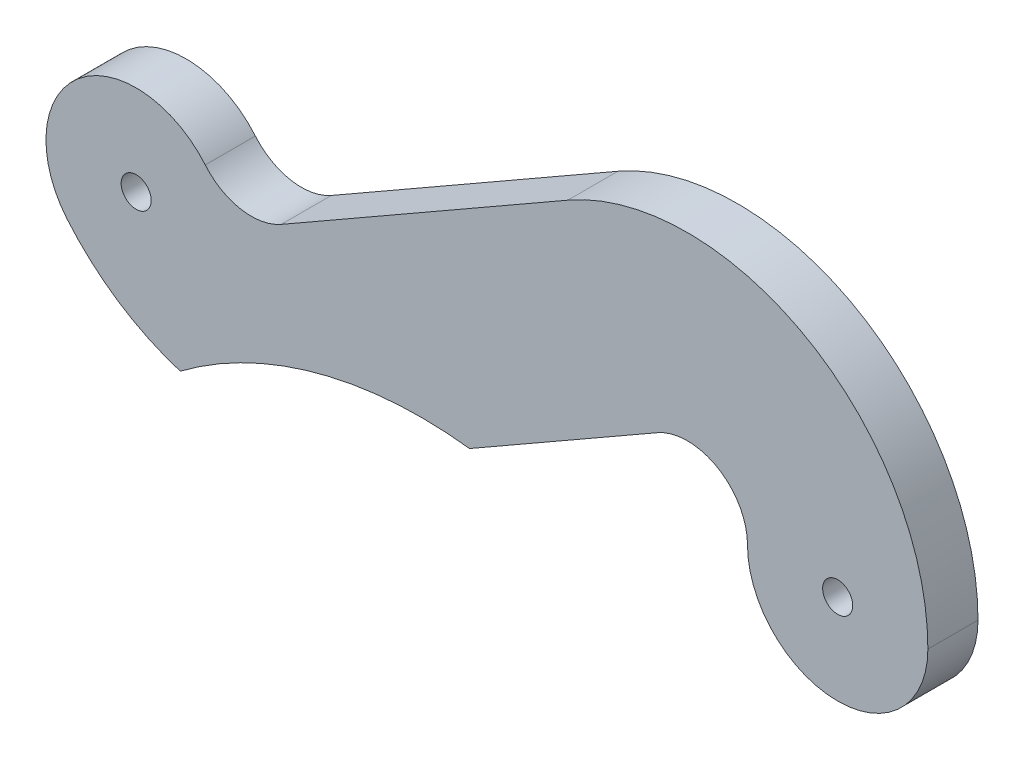
ISO-10303-21;
HEADER;
FILE_DESCRIPTION(('STEP AP214'),'2;1');
FILE_NAME('part.step','',(''),(''),'','','');
FILE_SCHEMA(('AUTOMOTIVE_DESIGN { 1 0 10303 214 1 1 1 1 }'));
ENDSEC;
DATA;
#1=APPLICATION_CONTEXT('core data for automotive mechanical design processes');
#2=APPLICATION_PROTOCOL_DEFINITION('international standard','automotive_design',2000,#1);
#3=PRODUCT_CONTEXT('',#1,'mechanical');
#4=PRODUCT('Part','Part','',(#3));
#5=PRODUCT_RELATED_PRODUCT_CATEGORY('part','',(#4));
#6=PRODUCT_DEFINITION_FORMATION('','',#4);
#7=PRODUCT_DEFINITION_CONTEXT('part definition',#1,'design');
#8=PRODUCT_DEFINITION('design','',#6,#7);
#9=PRODUCT_DEFINITION_SHAPE('','',#8);
#10=(LENGTH_UNIT() NAMED_UNIT(*) SI_UNIT(.MILLI.,.METRE.));
#11=(NAMED_UNIT(*) PLANE_ANGLE_UNIT() SI_UNIT($,.RADIAN.));
#12=(NAMED_UNIT(*) SI_UNIT($,.STERADIAN.) SOLID_ANGLE_UNIT());
#13=UNCERTAINTY_MEASURE_WITH_UNIT(LENGTH_MEASURE(1.E-05),#10,'distance_accuracy_value','');
#14=(GEOMETRIC_REPRESENTATION_CONTEXT(3) GLOBAL_UNCERTAINTY_ASSIGNED_CONTEXT((#13)) GLOBAL_UNIT_ASSIGNED_CONTEXT((#10,
#11,#12)) REPRESENTATION_CONTEXT('',''));
#15=CARTESIAN_POINT('',(0.,0.,0.));
#16=DIRECTION('',(0.,0.,1.));
#17=DIRECTION('',(1.,0.,0.));
#18=AXIS2_PLACEMENT_3D('',#15,#16,#17);
#19=CARTESIAN_POINT('',(11.4906666467847,9.64181414529811,5.));
#20=DIRECTION('',(0.,0.,1.));
#21=DIRECTION('',(1.,0.,0.));
#22=AXIS2_PLACEMENT_3D('',#19,#20,#21);
#23=PLANE('',#22);
#24=CARTESIAN_POINT('',(28.4512906579114,-45.2499284538988,5.));
#25=DIRECTION('',(0.,0.,1.));
#26=DIRECTION('',(-1.,0.,0.));
#27=AXIS2_PLACEMENT_3D('',#24,#25,#26);
#28=CIRCLE('',#27,40.);
#29=CARTESIAN_POINT('',(33.2657020757444,-5.5407173977743,5.));
#30=VERTEX_POINT('',#29);
#31=CARTESIAN_POINT('',(4.40154167070966,-13.2873006887636,5.));
#32=VERTEX_POINT('',#31);
#33=EDGE_CURVE('E181',#30,#32,#28,.T.);
#34=ORIENTED_EDGE('',*,*,#33,.F.);
#35=DIRECTION('',(0.867612200916755,0.497241459273445,0.));
#36=VECTOR('',#35,1.);
#37=CARTESIAN_POINT('',(23.4244616693473,-11.180878676704,5.));
#38=LINE('',#37,#36);
#39=CARTESIAN_POINT('',(52.0165512443593,5.20567320550047,5.));
#40=VERTEX_POINT('',#39);
#41=EDGE_CURVE('E186',#30,#40,#38,.T.);
#42=ORIENTED_EDGE('',*,*,#41,.T.);
#43=CARTESIAN_POINT('',(55.,0.,5.));
#44=DIRECTION('',(0.,0.,-1.));
#45=DIRECTION('',(1.,0.,0.));
#46=AXIS2_PLACEMENT_3D('',#43,#44,#45);
#47=CIRCLE('',#46,6.);
#48=CARTESIAN_POINT('',(61.,0.,5.));
#49=VERTEX_POINT('',#48);
#50=EDGE_CURVE('E115',#40,#49,#47,.T.);
#51=ORIENTED_EDGE('',*,*,#50,.T.);
#52=CARTESIAN_POINT('',(70.,0.,5.));
#53=DIRECTION('',(0.,0.,1.));
#54=DIRECTION('',(1.,0.,0.));
#55=AXIS2_PLACEMENT_3D('',#52,#53,#54);
#56=CIRCLE('',#55,9.);
#57=CARTESIAN_POINT('',(79.,0.,5.));
#58=VERTEX_POINT('',#57);
#59=EDGE_CURVE('E107',#49,#58,#56,.T.);
#60=ORIENTED_EDGE('',*,*,#59,.T.);
#61=CARTESIAN_POINT('',(55.,0.,5.));
#62=DIRECTION('',(0.,0.,1.));
#63=DIRECTION('',(1.,0.,0.));
#64=AXIS2_PLACEMENT_3D('',#61,#62,#63);
#65=CIRCLE('',#64,24.);
#66=CARTESIAN_POINT('',(43.0662049774373,20.8226928220021,5.));
#67=VERTEX_POINT('',#66);
#68=EDGE_CURVE('E112',#58,#67,#65,.T.);
#69=ORIENTED_EDGE('',*,*,#68,.T.);
#70=DIRECTION('',(-0.867612200916755,-0.497241459273445,0.));
#71=VECTOR('',#70,1.);
#72=CARTESIAN_POINT('',(14.4741154024253,4.43614093979759,5.));
#73=LINE('',#72,#71);
#74=CARTESIAN_POINT('',(14.4741154024253,4.43614093979759,5.));
#75=VERTEX_POINT('',#74);
#76=EDGE_CURVE('E56',#67,#75,#73,.T.);
#77=ORIENTED_EDGE('',*,*,#76,.T.);
#78=CARTESIAN_POINT('',(11.4906666467847,9.64181414529811,5.));
#79=DIRECTION('',(0.,0.,-1.));
#80=DIRECTION('',(1.,0.,0.));
#81=AXIS2_PLACEMENT_3D('',#78,#79,#80);
#82=CIRCLE('',#81,6.);
#83=CARTESIAN_POINT('',(6.89439998807079,5.78508848717887,5.));
#84=VERTEX_POINT('',#83);
#85=EDGE_CURVE('E153',#75,#84,#82,.T.);
#86=ORIENTED_EDGE('',*,*,#85,.T.);
#87=CARTESIAN_POINT('',(0.,0.,5.));
#88=DIRECTION('',(0.,0.,1.));
#89=DIRECTION('',(1.,0.,0.));
#90=AXIS2_PLACEMENT_3D('',#87,#88,#89);
#91=CIRCLE('',#90,9.);
#92=CARTESIAN_POINT('',(-6.89439998807079,-5.78508848717887,5.));
#93=VERTEX_POINT('',#92);
#94=EDGE_CURVE('E95',#84,#93,#91,.T.);
#95=ORIENTED_EDGE('',*,*,#94,.T.);
#96=CARTESIAN_POINT('',(11.4906666467847,9.64181414529811,5.));
#97=DIRECTION('',(0.,0.,1.));
#98=DIRECTION('',(1.,0.,0.));
#99=AXIS2_PLACEMENT_3D('',#96,#97,#98);
#100=CIRCLE('',#99,24.);
#101=EDGE_CURVE('E188',#93,#32,#100,.T.);
#102=ORIENTED_EDGE('',*,*,#101,.T.);
#103=EDGE_LOOP('',(#34,#42,#51,#60,#69,#77,#86,#95,#102));
#104=FACE_BOUND('',#103,.T.);
#105=CARTESIAN_POINT('',(70.,0.,5.));
#106=DIRECTION('',(0.,0.,1.));
#107=DIRECTION('',(1.,0.,0.));
#108=AXIS2_PLACEMENT_3D('',#105,#106,#107);
#109=CIRCLE('',#108,1.5);
#110=CARTESIAN_POINT('',(71.5,0.,5.));
#111=VERTEX_POINT('',#110);
#112=EDGE_CURVE('E140',#111,#111,#109,.T.);
#113=ORIENTED_EDGE('',*,*,#112,.F.);
#114=EDGE_LOOP('',(#113));
#115=FACE_BOUND('',#114,.T.);
#116=CARTESIAN_POINT('',(0.,0.,5.));
#117=DIRECTION('',(0.,0.,1.));
#118=DIRECTION('',(1.,0.,0.));
#119=AXIS2_PLACEMENT_3D('',#116,#117,#118);
#120=CIRCLE('',#119,1.5);
#121=CARTESIAN_POINT('',(1.5,0.,5.));
#122=VERTEX_POINT('',#121);
#123=EDGE_CURVE('E199',#122,#122,#120,.T.);
#124=ORIENTED_EDGE('',*,*,#123,.F.);
#125=EDGE_LOOP('',(#124));
#126=FACE_BOUND('',#125,.T.);
#127=ADVANCED_FACE('F33',(#104,#115,#126),#23,.T.);
#128=CARTESIAN_POINT('',(11.4906666467847,9.64181414529811,0.));
#129=DIRECTION('',(0.,0.,1.));
#130=DIRECTION('',(1.,0.,0.));
#131=AXIS2_PLACEMENT_3D('',#128,#129,#130);
#132=PLANE('',#131);
#133=CARTESIAN_POINT('',(70.,0.,0.));
#134=DIRECTION('',(0.,0.,1.));
#135=DIRECTION('',(1.,0.,0.));
#136=AXIS2_PLACEMENT_3D('',#133,#134,#135);
#137=CIRCLE('',#136,1.5);
#138=CARTESIAN_POINT('',(71.5,0.,0.));
#139=VERTEX_POINT('',#138);
#140=EDGE_CURVE('E196',#139,#139,#137,.T.);
#141=ORIENTED_EDGE('',*,*,#140,.T.);
#142=EDGE_LOOP('',(#141));
#143=FACE_BOUND('',#142,.T.);
#144=DIRECTION('',(0.867612200916755,0.497241459273445,0.));
#145=VECTOR('',#144,1.);
#146=CARTESIAN_POINT('',(23.4244616693473,-11.180878676704,0.));
#147=LINE('',#146,#145);
#148=CARTESIAN_POINT('',(33.2657020757444,-5.5407173977743,0.));
#149=VERTEX_POINT('',#148);
#150=CARTESIAN_POINT('',(52.0165512443593,5.20567320550047,0.));
#151=VERTEX_POINT('',#150);
#152=EDGE_CURVE('E145',#149,#151,#147,.T.);
#153=ORIENTED_EDGE('',*,*,#152,.F.);
#154=CARTESIAN_POINT('',(28.4512906579114,-45.2499284538988,0.));
#155=DIRECTION('',(0.,0.,1.));
#156=DIRECTION('',(1.,0.,0.));
#157=AXIS2_PLACEMENT_3D('',#154,#155,#156);
#158=CIRCLE('',#157,40.);
#159=CARTESIAN_POINT('',(4.40154167070966,-13.2873006887636,0.));
#160=VERTEX_POINT('',#159);
#161=EDGE_CURVE('E48',#149,#160,#158,.T.);
#162=ORIENTED_EDGE('',*,*,#161,.T.);
#163=CARTESIAN_POINT('',(11.4906666467847,9.64181414529811,0.));
#164=DIRECTION('',(0.,0.,1.));
#165=DIRECTION('',(1.,0.,0.));
#166=AXIS2_PLACEMENT_3D('',#163,#164,#165);
#167=CIRCLE('',#166,24.);
#168=CARTESIAN_POINT('',(-6.89439998807079,-5.78508848717887,0.));
#169=VERTEX_POINT('',#168);
#170=EDGE_CURVE('E142',#169,#160,#167,.T.);
#171=ORIENTED_EDGE('',*,*,#170,.F.);
#172=CARTESIAN_POINT('',(0.,0.,0.));
#173=DIRECTION('',(0.,0.,1.));
#174=DIRECTION('',(1.,0.,0.));
#175=AXIS2_PLACEMENT_3D('',#172,#173,#174);
#176=CIRCLE('',#175,9.);
#177=CARTESIAN_POINT('',(6.89439998807079,5.78508848717887,0.));
#178=VERTEX_POINT('',#177);
#179=EDGE_CURVE('E139',#178,#169,#176,.T.);
#180=ORIENTED_EDGE('',*,*,#179,.F.);
#181=CARTESIAN_POINT('',(11.4906666467847,9.64181414529811,0.));
#182=DIRECTION('',(0.,0.,-1.));
#183=DIRECTION('',(1.,0.,0.));
#184=AXIS2_PLACEMENT_3D('',#181,#182,#183);
#185=CIRCLE('',#184,6.);
#186=CARTESIAN_POINT('',(14.4741154024253,4.43614093979759,0.));
#187=VERTEX_POINT('',#186);
#188=EDGE_CURVE('E136',#187,#178,#185,.T.);
#189=ORIENTED_EDGE('',*,*,#188,.F.);
#190=DIRECTION('',(-0.867612200916755,-0.497241459273445,0.));
#191=VECTOR('',#190,1.);
#192=CARTESIAN_POINT('',(14.4741154024253,4.43614093979759,0.));
#193=LINE('',#192,#191);
#194=CARTESIAN_POINT('',(43.0662049774373,20.8226928220021,0.));
#195=VERTEX_POINT('',#194);
#196=EDGE_CURVE('E86',#195,#187,#193,.T.);
#197=ORIENTED_EDGE('',*,*,#196,.F.);
#198=CARTESIAN_POINT('',(55.,0.,0.));
#199=DIRECTION('',(0.,0.,1.));
#200=DIRECTION('',(1.,0.,0.));
#201=AXIS2_PLACEMENT_3D('',#198,#199,#200);
#202=CIRCLE('',#201,24.);
#203=CARTESIAN_POINT('',(79.,0.,0.));
#204=VERTEX_POINT('',#203);
#205=EDGE_CURVE('E150',#204,#195,#202,.T.);
#206=ORIENTED_EDGE('',*,*,#205,.F.);
#207=CARTESIAN_POINT('',(70.,0.,0.));
#208=DIRECTION('',(0.,0.,1.));
#209=DIRECTION('',(1.,0.,0.));
#210=AXIS2_PLACEMENT_3D('',#207,#208,#209);
#211=CIRCLE('',#210,9.);
#212=CARTESIAN_POINT('',(61.,0.,0.));
#213=VERTEX_POINT('',#212);
#214=EDGE_CURVE('E124',#213,#204,#211,.T.);
#215=ORIENTED_EDGE('',*,*,#214,.F.);
#216=CARTESIAN_POINT('',(55.,0.,0.));
#217=DIRECTION('',(0.,0.,-1.));
#218=DIRECTION('',(1.,0.,0.));
#219=AXIS2_PLACEMENT_3D('',#216,#217,#218);
#220=CIRCLE('',#219,6.);
#221=EDGE_CURVE('E147',#151,#213,#220,.T.);
#222=ORIENTED_EDGE('',*,*,#221,.F.);
#223=EDGE_LOOP('',(#153,#162,#171,#180,#189,#197,#206,#215,#222));
#224=FACE_BOUND('',#223,.T.);
#225=CARTESIAN_POINT('',(0.,0.,0.));
#226=DIRECTION('',(0.,0.,1.));
#227=DIRECTION('',(1.,0.,0.));
#228=AXIS2_PLACEMENT_3D('',#225,#226,#227);
#229=CIRCLE('',#228,1.5);
#230=CARTESIAN_POINT('',(1.5,0.,0.));
#231=VERTEX_POINT('',#230);
#232=EDGE_CURVE('E202',#231,#231,#229,.T.);
#233=ORIENTED_EDGE('',*,*,#232,.T.);
#234=EDGE_LOOP('',(#233));
#235=FACE_BOUND('',#234,.T.);
#236=ADVANCED_FACE('F169',(#143,#224,#235),#132,.F.);
#237=CARTESIAN_POINT('',(11.4906666467847,9.64181414529811,5.));
#238=DIRECTION('',(0.,0.,-1.));
#239=DIRECTION('',(-1.,0.,0.));
#240=AXIS2_PLACEMENT_3D('',#237,#238,#239);
#241=CYLINDRICAL_SURFACE('',#240,6.);
#242=ORIENTED_EDGE('',*,*,#188,.T.);
#243=DIRECTION('',(0.,0.,-1.));
#244=VECTOR('',#243,1.);
#245=CARTESIAN_POINT('',(6.89439998807079,5.78508848717887,5.));
#246=LINE('',#245,#244);
#247=EDGE_CURVE('E41',#84,#178,#246,.T.);
#248=ORIENTED_EDGE('',*,*,#247,.F.);
#249=ORIENTED_EDGE('',*,*,#85,.F.);
#250=DIRECTION('',(0.,0.,-1.));
#251=VECTOR('',#250,1.);
#252=CARTESIAN_POINT('',(14.4741154024253,4.43614093979759,5.));
#253=LINE('',#252,#251);
#254=EDGE_CURVE('E132',#75,#187,#253,.T.);
#255=ORIENTED_EDGE('',*,*,#254,.T.);
#256=EDGE_LOOP('',(#242,#248,#249,#255));
#257=FACE_BOUND('',#256,.T.);
#258=ADVANCED_FACE('F35',(#257),#241,.F.);
#259=CARTESIAN_POINT('',(0.,0.,5.));
#260=DIRECTION('',(0.,0.,-1.));
#261=DIRECTION('',(-1.,0.,0.));
#262=AXIS2_PLACEMENT_3D('',#259,#260,#261);
#263=CYLINDRICAL_SURFACE('',#262,9.);
#264=ORIENTED_EDGE('',*,*,#179,.T.);
#265=DIRECTION('',(0.,0.,-1.));
#266=VECTOR('',#265,1.);
#267=CARTESIAN_POINT('',(-6.89439998807079,-5.78508848717887,5.));
#268=LINE('',#267,#266);
#269=EDGE_CURVE('E160',#93,#169,#268,.T.);
#270=ORIENTED_EDGE('',*,*,#269,.F.);
#271=ORIENTED_EDGE('',*,*,#94,.F.);
#272=ORIENTED_EDGE('',*,*,#247,.T.);
#273=EDGE_LOOP('',(#264,#270,#271,#272));
#274=FACE_BOUND('',#273,.T.);
#275=ADVANCED_FACE('F163',(#274),#263,.T.);
#276=CARTESIAN_POINT('',(11.4906666467847,9.64181414529811,5.));
#277=DIRECTION('',(0.,0.,-1.));
#278=DIRECTION('',(-1.,0.,0.));
#279=AXIS2_PLACEMENT_3D('',#276,#277,#278);
#280=CYLINDRICAL_SURFACE('',#279,24.);
#281=ORIENTED_EDGE('',*,*,#170,.T.);
#282=DIRECTION('',(0.,0.,1.));
#283=VECTOR('',#282,1.);
#284=CARTESIAN_POINT('',(4.40154167070966,-13.2873006887636,-5.));
#285=LINE('',#284,#283);
#286=EDGE_CURVE('E177',#160,#32,#285,.T.);
#287=ORIENTED_EDGE('',*,*,#286,.T.);
#288=ORIENTED_EDGE('',*,*,#101,.F.);
#289=ORIENTED_EDGE('',*,*,#269,.T.);
#290=EDGE_LOOP('',(#281,#287,#288,#289));
#291=FACE_BOUND('',#290,.T.);
#292=ADVANCED_FACE('F174',(#291),#280,.T.);
#293=CARTESIAN_POINT('',(23.4244616693473,-11.180878676704,5.));
#294=DIRECTION('',(-0.497241459273445,0.867612200916755,0.));
#295=DIRECTION('',(-0.867612200916755,-0.497241459273445,0.));
#296=AXIS2_PLACEMENT_3D('',#293,#294,#295);
#297=PLANE('',#296);
#298=ORIENTED_EDGE('',*,*,#41,.F.);
#299=DIRECTION('',(0.,0.,1.));
#300=VECTOR('',#299,1.);
#301=CARTESIAN_POINT('',(33.2657020757444,-5.5407173977743,-5.));
#302=LINE('',#301,#300);
#303=EDGE_CURVE('E11',#30,#149,#302,.F.);
#304=ORIENTED_EDGE('',*,*,#303,.T.);
#305=ORIENTED_EDGE('',*,*,#152,.T.);
#306=DIRECTION('',(0.,0.,-1.));
#307=VECTOR('',#306,1.);
#308=CARTESIAN_POINT('',(52.0165512443593,5.20567320550047,5.));
#309=LINE('',#308,#307);
#310=EDGE_CURVE('E157',#40,#151,#309,.T.);
#311=ORIENTED_EDGE('',*,*,#310,.F.);
#312=EDGE_LOOP('',(#298,#304,#305,#311));
#313=FACE_BOUND('',#312,.T.);
#314=ADVANCED_FACE('F190',(#313),#297,.F.);
#315=CARTESIAN_POINT('',(55.,0.,5.));
#316=DIRECTION('',(0.,0.,-1.));
#317=DIRECTION('',(-1.,0.,0.));
#318=AXIS2_PLACEMENT_3D('',#315,#316,#317);
#319=CYLINDRICAL_SURFACE('',#318,6.);
#320=ORIENTED_EDGE('',*,*,#221,.T.);
#321=DIRECTION('',(0.,0.,-1.));
#322=VECTOR('',#321,1.);
#323=CARTESIAN_POINT('',(61.,0.,5.));
#324=LINE('',#323,#322);
#325=EDGE_CURVE('E127',#49,#213,#324,.T.);
#326=ORIENTED_EDGE('',*,*,#325,.F.);
#327=ORIENTED_EDGE('',*,*,#50,.F.);
#328=ORIENTED_EDGE('',*,*,#310,.T.);
#329=EDGE_LOOP('',(#320,#326,#327,#328));
#330=FACE_BOUND('',#329,.T.);
#331=ADVANCED_FACE('F231',(#330),#319,.F.);
#332=CARTESIAN_POINT('',(70.,0.,5.));
#333=DIRECTION('',(0.,0.,-1.));
#334=DIRECTION('',(-1.,0.,0.));
#335=AXIS2_PLACEMENT_3D('',#332,#333,#334);
#336=CYLINDRICAL_SURFACE('',#335,9.);
#337=ORIENTED_EDGE('',*,*,#214,.T.);
#338=DIRECTION('',(0.,0.,-1.));
#339=VECTOR('',#338,1.);
#340=CARTESIAN_POINT('',(79.,0.,5.));
#341=LINE('',#340,#339);
#342=EDGE_CURVE('E121',#58,#204,#341,.T.);
#343=ORIENTED_EDGE('',*,*,#342,.F.);
#344=ORIENTED_EDGE('',*,*,#59,.F.);
#345=ORIENTED_EDGE('',*,*,#325,.T.);
#346=EDGE_LOOP('',(#337,#343,#344,#345));
#347=FACE_BOUND('',#346,.T.);
#348=ADVANCED_FACE('F122',(#347),#336,.T.);
#349=CARTESIAN_POINT('',(55.,0.,5.));
#350=DIRECTION('',(0.,0.,-1.));
#351=DIRECTION('',(-1.,0.,0.));
#352=AXIS2_PLACEMENT_3D('',#349,#350,#351);
#353=CYLINDRICAL_SURFACE('',#352,24.);
#354=ORIENTED_EDGE('',*,*,#205,.T.);
#355=DIRECTION('',(0.,0.,-1.));
#356=VECTOR('',#355,1.);
#357=CARTESIAN_POINT('',(43.0662049774373,20.8226928220021,5.));
#358=LINE('',#357,#356);
#359=EDGE_CURVE('E128',#67,#195,#358,.T.);
#360=ORIENTED_EDGE('',*,*,#359,.F.);
#361=ORIENTED_EDGE('',*,*,#68,.F.);
#362=ORIENTED_EDGE('',*,*,#342,.T.);
#363=EDGE_LOOP('',(#354,#360,#361,#362));
#364=FACE_BOUND('',#363,.T.);
#365=ADVANCED_FACE('F130',(#364),#353,.T.);
#366=CARTESIAN_POINT('',(14.4741154024253,4.43614093979759,5.));
#367=DIRECTION('',(0.497241459273444,-0.867612200916755,0.));
#368=DIRECTION('',(0.867612200916755,0.497241459273445,0.));
#369=AXIS2_PLACEMENT_3D('',#366,#367,#368);
#370=PLANE('',#369);
#371=ORIENTED_EDGE('',*,*,#196,.T.);
#372=ORIENTED_EDGE('',*,*,#254,.F.);
#373=ORIENTED_EDGE('',*,*,#76,.F.);
#374=ORIENTED_EDGE('',*,*,#359,.T.);
#375=EDGE_LOOP('',(#371,#372,#373,#374));
#376=FACE_BOUND('',#375,.T.);
#377=ADVANCED_FACE('F224',(#376),#370,.F.);
#378=CARTESIAN_POINT('',(70.,0.,5.));
#379=DIRECTION('',(0.,0.,-1.));
#380=DIRECTION('',(-1.,0.,0.));
#381=AXIS2_PLACEMENT_3D('',#378,#379,#380);
#382=CYLINDRICAL_SURFACE('',#381,1.5);
#383=ORIENTED_EDGE('',*,*,#112,.T.);
#384=EDGE_LOOP('',(#383));
#385=FACE_BOUND('',#384,.T.);
#386=ORIENTED_EDGE('',*,*,#140,.F.);
#387=EDGE_LOOP('',(#386));
#388=FACE_BOUND('',#387,.T.);
#389=ADVANCED_FACE('F221',(#385,#388),#382,.F.);
#390=CARTESIAN_POINT('',(0.,0.,5.));
#391=DIRECTION('',(0.,0.,-1.));
#392=DIRECTION('',(-1.,0.,0.));
#393=AXIS2_PLACEMENT_3D('',#390,#391,#392);
#394=CYLINDRICAL_SURFACE('',#393,1.5);
#395=ORIENTED_EDGE('',*,*,#123,.T.);
#396=EDGE_LOOP('',(#395));
#397=FACE_BOUND('',#396,.T.);
#398=ORIENTED_EDGE('',*,*,#232,.F.);
#399=EDGE_LOOP('',(#398));
#400=FACE_BOUND('',#399,.T.);
#401=ADVANCED_FACE('F210',(#397,#400),#394,.F.);
#402=CARTESIAN_POINT('',(28.4512906579114,-45.2499284538988,-5.));
#403=DIRECTION('',(0.,0.,1.));
#404=DIRECTION('',(1.,0.,0.));
#405=AXIS2_PLACEMENT_3D('',#402,#403,#404);
#406=CYLINDRICAL_SURFACE('',#405,40.);
#407=ORIENTED_EDGE('',*,*,#303,.F.);
#408=ORIENTED_EDGE('',*,*,#33,.T.);
#409=ORIENTED_EDGE('',*,*,#286,.F.);
#410=ORIENTED_EDGE('',*,*,#161,.F.);
#411=EDGE_LOOP('',(#407,#408,#409,#410));
#412=FACE_BOUND('',#411,.T.);
#413=ADVANCED_FACE('F183',(#412),#406,.F.);
#414=CLOSED_SHELL('',(#127,#236,#258,#275,#292,#314,#331,#348,#365,#377,#389,#401,#413));
#415=MANIFOLD_SOLID_BREP('B2',#414);
#416=ADVANCED_BREP_SHAPE_REPRESENTATION('',(#18,#415),#14);
#417=SHAPE_DEFINITION_REPRESENTATION(#9,#416);
ENDSEC;
END-ISO-10303-21;
